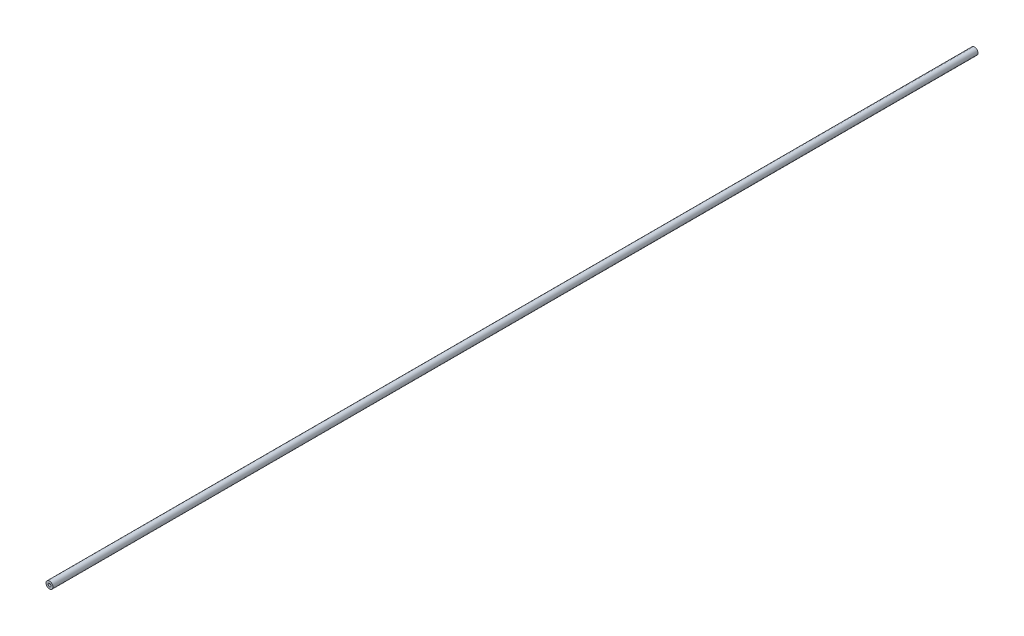
ISO-10303-21;
HEADER;
FILE_DESCRIPTION(('STEP AP214'),'2;1');
FILE_NAME('part.step','',(''),(''),'','','');
FILE_SCHEMA(('AUTOMOTIVE_DESIGN { 1 0 10303 214 1 1 1 1 }'));
ENDSEC;
DATA;
#1=APPLICATION_CONTEXT('core data for automotive mechanical design processes');
#2=APPLICATION_PROTOCOL_DEFINITION('international standard','automotive_design',2000,#1);
#3=PRODUCT_CONTEXT('',#1,'mechanical');
#4=PRODUCT('Part','Part','',(#3));
#5=PRODUCT_RELATED_PRODUCT_CATEGORY('part','',(#4));
#6=PRODUCT_DEFINITION_FORMATION('','',#4);
#7=PRODUCT_DEFINITION_CONTEXT('part definition',#1,'design');
#8=PRODUCT_DEFINITION('design','',#6,#7);
#9=PRODUCT_DEFINITION_SHAPE('','',#8);
#10=(LENGTH_UNIT() NAMED_UNIT(*) SI_UNIT(.MILLI.,.METRE.));
#11=(NAMED_UNIT(*) PLANE_ANGLE_UNIT() SI_UNIT($,.RADIAN.));
#12=(NAMED_UNIT(*) SI_UNIT($,.STERADIAN.) SOLID_ANGLE_UNIT());
#13=UNCERTAINTY_MEASURE_WITH_UNIT(LENGTH_MEASURE(1.E-05),#10,'distance_accuracy_value','');
#14=(GEOMETRIC_REPRESENTATION_CONTEXT(3) GLOBAL_UNCERTAINTY_ASSIGNED_CONTEXT((#13)) GLOBAL_UNIT_ASSIGNED_CONTEXT((#10,
#11,#12)) REPRESENTATION_CONTEXT('',''));
#15=CARTESIAN_POINT('',(0.,0.,0.));
#16=DIRECTION('',(0.,0.,1.));
#17=DIRECTION('',(1.,0.,0.));
#18=AXIS2_PLACEMENT_3D('',#15,#16,#17);
#19=CARTESIAN_POINT('',(0.,0.,21.73605425831));
#20=DIRECTION('',(0.,0.,-1.));
#21=DIRECTION('',(1.,0.,0.));
#22=AXIS2_PLACEMENT_3D('',#19,#20,#21);
#23=CONICAL_SURFACE('',#22,1.275,1.02974425867665);
#24=DIRECTION('',(-0.857167300702112,0.,-0.515038074910054));
#25=VECTOR('',#24,1.);
#26=CARTESIAN_POINT('',(-1.275,0.,21.73605425831));
#27=LINE('',#26,#25);
#28=CARTESIAN_POINT('',(0.,0.,22.50215154757));
#29=VERTEX_POINT('',#28);
#30=CARTESIAN_POINT('',(-2.5,0.,21.));
#31=VERTEX_POINT('',#30);
#32=EDGE_CURVE('E11',#29,#31,#27,.T.);
#33=ORIENTED_EDGE('',*,*,#32,.T.);
#34=CARTESIAN_POINT('',(0.,0.,21.));
#35=DIRECTION('',(0.,0.,-1.));
#36=DIRECTION('',(1.,0.,0.));
#37=AXIS2_PLACEMENT_3D('',#34,#35,#36);
#38=CIRCLE('',#37,2.5);
#39=EDGE_CURVE('E87',#31,#31,#38,.T.);
#40=ORIENTED_EDGE('',*,*,#39,.T.);
#41=ORIENTED_EDGE('',*,*,#32,.F.);
#42=EDGE_LOOP('',(#33,#40,#41));
#43=FACE_BOUND('',#42,.T.);
#44=ADVANCED_FACE('F17',(#43),#23,.F.);
#45=CARTESIAN_POINT('',(0.,0.,23.32725912495));
#46=DIRECTION('',(0.,0.,-1.));
#47=DIRECTION('',(1.,0.,0.));
#48=AXIS2_PLACEMENT_3D('',#45,#46,#47);
#49=CYLINDRICAL_SURFACE('',#48,2.5);
#50=ORIENTED_EDGE('',*,*,#39,.F.);
#51=DIRECTION('',(0.,0.,-1.));
#52=VECTOR('',#51,1.);
#53=CARTESIAN_POINT('',(-2.5,0.,23.32725912495));
#54=LINE('',#53,#52);
#55=CARTESIAN_POINT('',(-2.5,0.,6.));
#56=VERTEX_POINT('',#55);
#57=EDGE_CURVE('E28',#31,#56,#54,.T.);
#58=ORIENTED_EDGE('',*,*,#57,.T.);
#59=CARTESIAN_POINT('',(0.,0.,6.));
#60=DIRECTION('',(0.,0.,-1.));
#61=DIRECTION('',(1.,0.,0.));
#62=AXIS2_PLACEMENT_3D('',#59,#60,#61);
#63=CIRCLE('',#62,2.5);
#64=EDGE_CURVE('E21',#56,#56,#63,.T.);
#65=ORIENTED_EDGE('',*,*,#64,.T.);
#66=ORIENTED_EDGE('',*,*,#57,.F.);
#67=EDGE_LOOP('',(#50,#58,#65,#66));
#68=FACE_BOUND('',#67,.T.);
#69=ADVANCED_FACE('F154',(#68),#49,.F.);
#70=CARTESIAN_POINT('',(0.,0.,1590.263945742));
#71=DIRECTION('',(0.,0.,1.));
#72=DIRECTION('',(-1.,0.,0.));
#73=AXIS2_PLACEMENT_3D('',#70,#71,#72);
#74=CONICAL_SURFACE('',#73,1.275,1.02974425867665);
#75=DIRECTION('',(0.857167300702112,0.,0.515038074910054));
#76=VECTOR('',#75,1.);
#77=CARTESIAN_POINT('',(1.275,0.,1590.263945742));
#78=LINE('',#77,#76);
#79=CARTESIAN_POINT('',(0.,0.,1589.49784845274));
#80=VERTEX_POINT('',#79);
#81=CARTESIAN_POINT('',(2.5,0.,1591.));
#82=VERTEX_POINT('',#81);
#83=EDGE_CURVE('E82',#80,#82,#78,.T.);
#84=ORIENTED_EDGE('',*,*,#83,.T.);
#85=CARTESIAN_POINT('',(0.,0.,1591.));
#86=DIRECTION('',(0.,0.,1.));
#87=DIRECTION('',(-1.,0.,0.));
#88=AXIS2_PLACEMENT_3D('',#85,#86,#87);
#89=CIRCLE('',#88,2.5);
#90=EDGE_CURVE('E85',#82,#82,#89,.T.);
#91=ORIENTED_EDGE('',*,*,#90,.T.);
#92=ORIENTED_EDGE('',*,*,#83,.F.);
#93=EDGE_LOOP('',(#84,#91,#92));
#94=FACE_BOUND('',#93,.T.);
#95=ADVANCED_FACE('F84',(#94),#74,.F.);
#96=CARTESIAN_POINT('',(0.,0.,1588.672740875));
#97=DIRECTION('',(0.,0.,1.));
#98=DIRECTION('',(-1.,0.,0.));
#99=AXIS2_PLACEMENT_3D('',#96,#97,#98);
#100=CYLINDRICAL_SURFACE('',#99,2.5);
#101=ORIENTED_EDGE('',*,*,#90,.F.);
#102=DIRECTION('',(0.,0.,1.));
#103=VECTOR('',#102,1.);
#104=CARTESIAN_POINT('',(2.5,0.,1588.672740875));
#105=LINE('',#104,#103);
#106=CARTESIAN_POINT('',(2.5,0.,1606.));
#107=VERTEX_POINT('',#106);
#108=EDGE_CURVE('E75',#82,#107,#105,.T.);
#109=ORIENTED_EDGE('',*,*,#108,.T.);
#110=CARTESIAN_POINT('',(0.,0.,1606.));
#111=DIRECTION('',(0.,0.,1.));
#112=DIRECTION('',(-1.,0.,0.));
#113=AXIS2_PLACEMENT_3D('',#110,#111,#112);
#114=CIRCLE('',#113,2.5);
#115=EDGE_CURVE('E105',#107,#107,#114,.T.);
#116=ORIENTED_EDGE('',*,*,#115,.T.);
#117=ORIENTED_EDGE('',*,*,#108,.F.);
#118=EDGE_LOOP('',(#101,#109,#116,#117));
#119=FACE_BOUND('',#118,.T.);
#120=ADVANCED_FACE('F153',(#119),#100,.F.);
#121=CARTESIAN_POINT('',(0.,0.,1606.));
#122=DIRECTION('',(0.,0.,1.));
#123=DIRECTION('',(1.,0.,0.));
#124=AXIS2_PLACEMENT_3D('',#121,#122,#123);
#125=PLANE('',#124);
#126=ORIENTED_EDGE('',*,*,#115,.F.);
#127=EDGE_LOOP('',(#126));
#128=FACE_BOUND('',#127,.T.);
#129=CARTESIAN_POINT('',(0.,0.,1606.));
#130=DIRECTION('',(0.,0.,1.));
#131=DIRECTION('',(1.,0.,0.));
#132=AXIS2_PLACEMENT_3D('',#129,#130,#131);
#133=CIRCLE('',#132,6.);
#134=CARTESIAN_POINT('',(-6.,0.,1606.));
#135=VERTEX_POINT('',#134);
#136=EDGE_CURVE('E97',#135,#135,#133,.T.);
#137=ORIENTED_EDGE('',*,*,#136,.T.);
#138=EDGE_LOOP('',(#137));
#139=FACE_BOUND('',#138,.T.);
#140=ADVANCED_FACE('F165',(#128,#139),#125,.T.);
#141=CARTESIAN_POINT('',(0.,0.,6.));
#142=DIRECTION('',(0.,0.,1.));
#143=DIRECTION('',(1.,0.,0.));
#144=AXIS2_PLACEMENT_3D('',#141,#142,#143);
#145=CYLINDRICAL_SURFACE('',#144,6.);
#146=ORIENTED_EDGE('',*,*,#136,.F.);
#147=DIRECTION('',(0.,0.,-1.));
#148=VECTOR('',#147,1.);
#149=CARTESIAN_POINT('',(-6.,0.,6.));
#150=LINE('',#149,#148);
#151=CARTESIAN_POINT('',(-6.,0.,6.));
#152=VERTEX_POINT('',#151);
#153=EDGE_CURVE('E58',#135,#152,#150,.T.);
#154=ORIENTED_EDGE('',*,*,#153,.T.);
#155=CARTESIAN_POINT('',(0.,0.,6.));
#156=DIRECTION('',(0.,0.,1.));
#157=DIRECTION('',(1.,0.,0.));
#158=AXIS2_PLACEMENT_3D('',#155,#156,#157);
#159=CIRCLE('',#158,6.);
#160=EDGE_CURVE('E106',#152,#152,#159,.T.);
#161=ORIENTED_EDGE('',*,*,#160,.T.);
#162=ORIENTED_EDGE('',*,*,#153,.F.);
#163=EDGE_LOOP('',(#146,#154,#161,#162));
#164=FACE_BOUND('',#163,.T.);
#165=ADVANCED_FACE('F160',(#164),#145,.T.);
#166=CARTESIAN_POINT('',(0.,0.,6.));
#167=DIRECTION('',(0.,0.,1.));
#168=DIRECTION('',(1.,0.,0.));
#169=AXIS2_PLACEMENT_3D('',#166,#167,#168);
#170=PLANE('',#169);
#171=ORIENTED_EDGE('',*,*,#64,.F.);
#172=EDGE_LOOP('',(#171));
#173=FACE_BOUND('',#172,.T.);
#174=ORIENTED_EDGE('',*,*,#160,.F.);
#175=EDGE_LOOP('',(#174));
#176=FACE_BOUND('',#175,.T.);
#177=ADVANCED_FACE('F19',(#173,#176),#170,.F.);
#178=CLOSED_SHELL('',(#44,#69,#95,#120,#140,#165,#177));
#179=MANIFOLD_SOLID_BREP('B1',#178);
#180=ADVANCED_BREP_SHAPE_REPRESENTATION('',(#18,#179),#14);
#181=SHAPE_DEFINITION_REPRESENTATION(#9,#180);
ENDSEC;
END-ISO-10303-21;
